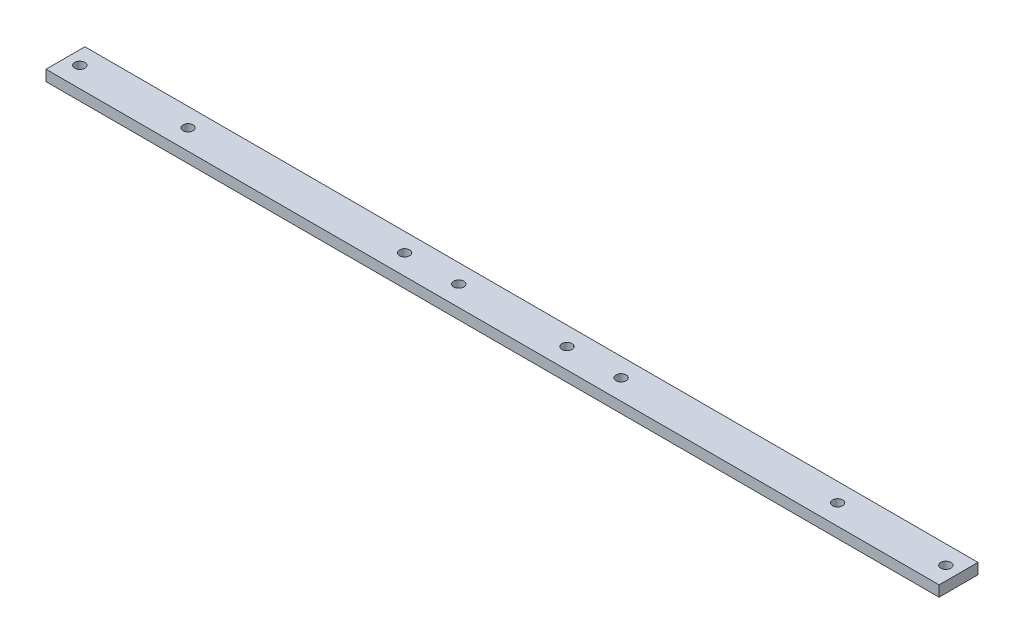
ISO-10303-21;
HEADER;
FILE_DESCRIPTION(('STEP AP214'),'2;1');
FILE_NAME('part.step','',(''),(''),'','','');
FILE_SCHEMA(('AUTOMOTIVE_DESIGN { 1 0 10303 214 1 1 1 1 }'));
ENDSEC;
DATA;
#1=APPLICATION_CONTEXT('core data for automotive mechanical design processes');
#2=APPLICATION_PROTOCOL_DEFINITION('international standard','automotive_design',2000,#1);
#3=PRODUCT_CONTEXT('',#1,'mechanical');
#4=PRODUCT('Part','Part','',(#3));
#5=PRODUCT_RELATED_PRODUCT_CATEGORY('part','',(#4));
#6=PRODUCT_DEFINITION_FORMATION('','',#4);
#7=PRODUCT_DEFINITION_CONTEXT('part definition',#1,'design');
#8=PRODUCT_DEFINITION('design','',#6,#7);
#9=PRODUCT_DEFINITION_SHAPE('','',#8);
#10=(LENGTH_UNIT() NAMED_UNIT(*) SI_UNIT(.MILLI.,.METRE.));
#11=(NAMED_UNIT(*) PLANE_ANGLE_UNIT() SI_UNIT($,.RADIAN.));
#12=(NAMED_UNIT(*) SI_UNIT($,.STERADIAN.) SOLID_ANGLE_UNIT());
#13=UNCERTAINTY_MEASURE_WITH_UNIT(LENGTH_MEASURE(1.E-05),#10,'distance_accuracy_value','');
#14=(GEOMETRIC_REPRESENTATION_CONTEXT(3) GLOBAL_UNCERTAINTY_ASSIGNED_CONTEXT((#13)) GLOBAL_UNIT_ASSIGNED_CONTEXT((#10,
#11,#12)) REPRESENTATION_CONTEXT('',''));
#15=CARTESIAN_POINT('',(0.,0.,0.));
#16=DIRECTION('',(0.,0.,1.));
#17=DIRECTION('',(1.,0.,0.));
#18=AXIS2_PLACEMENT_3D('',#15,#16,#17);
#19=CARTESIAN_POINT('',(4.,3.175,-4.53563414267659));
#20=DIRECTION('',(0.,-1.,0.));
#21=DIRECTION('',(0.,0.,-1.));
#22=AXIS2_PLACEMENT_3D('',#19,#20,#21);
#23=CYLINDRICAL_SURFACE('',#22,1.50000000000002);
#24=CARTESIAN_POINT('',(4.,3.175,-4.53563414267659));
#25=DIRECTION('',(0.,1.,0.));
#26=DIRECTION('',(0.,0.,1.));
#27=AXIS2_PLACEMENT_3D('',#24,#25,#26);
#28=CIRCLE('',#27,1.50000000000002);
#29=CARTESIAN_POINT('',(4.,3.175,-3.03563414267657));
#30=VERTEX_POINT('',#29);
#31=EDGE_CURVE('E131',#30,#30,#28,.F.);
#32=ORIENTED_EDGE('',*,*,#31,.F.);
#33=EDGE_LOOP('',(#32));
#34=FACE_BOUND('',#33,.T.);
#35=CARTESIAN_POINT('',(4.,0.,-4.53563414267659));
#36=DIRECTION('',(0.,1.,0.));
#37=DIRECTION('',(0.,0.,1.));
#38=AXIS2_PLACEMENT_3D('',#35,#36,#37);
#39=CIRCLE('',#38,1.50000000000002);
#40=CARTESIAN_POINT('',(4.,0.,-3.03563414267657));
#41=VERTEX_POINT('',#40);
#42=EDGE_CURVE('E152',#41,#41,#39,.F.);
#43=ORIENTED_EDGE('',*,*,#42,.T.);
#44=EDGE_LOOP('',(#43));
#45=FACE_BOUND('',#44,.T.);
#46=ADVANCED_FACE('F80',(#34,#45),#23,.F.);
#47=CARTESIAN_POINT('',(228.,3.175,-4.53563414267659));
#48=DIRECTION('',(0.,-1.,0.));
#49=DIRECTION('',(0.,0.,-1.));
#50=AXIS2_PLACEMENT_3D('',#47,#48,#49);
#51=CYLINDRICAL_SURFACE('',#50,1.5);
#52=CARTESIAN_POINT('',(228.,3.175,-4.53563414267659));
#53=DIRECTION('',(0.,1.,0.));
#54=DIRECTION('',(0.,0.,1.));
#55=AXIS2_PLACEMENT_3D('',#52,#53,#54);
#56=CIRCLE('',#55,1.5);
#57=CARTESIAN_POINT('',(228.,3.175,-3.03563414267659));
#58=VERTEX_POINT('',#57);
#59=EDGE_CURVE('E168',#58,#58,#56,.T.);
#60=ORIENTED_EDGE('',*,*,#59,.T.);
#61=EDGE_LOOP('',(#60));
#62=FACE_BOUND('',#61,.T.);
#63=CARTESIAN_POINT('',(228.,0.,-4.53563414267659));
#64=DIRECTION('',(0.,1.,0.));
#65=DIRECTION('',(0.,0.,1.));
#66=AXIS2_PLACEMENT_3D('',#63,#64,#65);
#67=CIRCLE('',#66,1.5);
#68=CARTESIAN_POINT('',(228.,0.,-3.03563414267659));
#69=VERTEX_POINT('',#68);
#70=EDGE_CURVE('E149',#69,#69,#67,.T.);
#71=ORIENTED_EDGE('',*,*,#70,.F.);
#72=EDGE_LOOP('',(#71));
#73=FACE_BOUND('',#72,.T.);
#74=ADVANCED_FACE('F178',(#62,#73),#51,.F.);
#75=CARTESIAN_POINT('',(260.,3.175,-4.53563414267659));
#76=DIRECTION('',(0.,-1.,0.));
#77=DIRECTION('',(0.,0.,-1.));
#78=AXIS2_PLACEMENT_3D('',#75,#76,#77);
#79=CYLINDRICAL_SURFACE('',#78,1.50000000000002);
#80=CARTESIAN_POINT('',(260.,3.175,-4.53563414267659));
#81=DIRECTION('',(0.,1.,0.));
#82=DIRECTION('',(0.,0.,1.));
#83=AXIS2_PLACEMENT_3D('',#80,#81,#82);
#84=CIRCLE('',#83,1.50000000000002);
#85=CARTESIAN_POINT('',(260.,3.175,-3.03563414267657));
#86=VERTEX_POINT('',#85);
#87=EDGE_CURVE('E166',#86,#86,#84,.T.);
#88=ORIENTED_EDGE('',*,*,#87,.T.);
#89=EDGE_LOOP('',(#88));
#90=FACE_BOUND('',#89,.T.);
#91=CARTESIAN_POINT('',(260.,0.,-4.53563414267659));
#92=DIRECTION('',(0.,1.,0.));
#93=DIRECTION('',(0.,0.,1.));
#94=AXIS2_PLACEMENT_3D('',#91,#92,#93);
#95=CIRCLE('',#94,1.50000000000002);
#96=CARTESIAN_POINT('',(260.,0.,-3.03563414267657));
#97=VERTEX_POINT('',#96);
#98=EDGE_CURVE('E146',#97,#97,#95,.T.);
#99=ORIENTED_EDGE('',*,*,#98,.F.);
#100=EDGE_LOOP('',(#99));
#101=FACE_BOUND('',#100,.T.);
#102=ADVANCED_FACE('F183',(#90,#101),#79,.F.);
#103=CARTESIAN_POINT('',(36.,3.175,-4.53563414267659));
#104=DIRECTION('',(0.,-1.,0.));
#105=DIRECTION('',(0.,0.,-1.));
#106=AXIS2_PLACEMENT_3D('',#103,#104,#105);
#107=CYLINDRICAL_SURFACE('',#106,1.5);
#108=CARTESIAN_POINT('',(36.,3.175,-4.53563414267659));
#109=DIRECTION('',(0.,1.,0.));
#110=DIRECTION('',(0.,0.,1.));
#111=AXIS2_PLACEMENT_3D('',#108,#109,#110);
#112=CIRCLE('',#111,1.5);
#113=CARTESIAN_POINT('',(36.,3.175,-3.03563414267659));
#114=VERTEX_POINT('',#113);
#115=EDGE_CURVE('E163',#114,#114,#112,.T.);
#116=ORIENTED_EDGE('',*,*,#115,.T.);
#117=EDGE_LOOP('',(#116));
#118=FACE_BOUND('',#117,.T.);
#119=CARTESIAN_POINT('',(36.,0.,-4.53563414267659));
#120=DIRECTION('',(0.,1.,0.));
#121=DIRECTION('',(0.,0.,1.));
#122=AXIS2_PLACEMENT_3D('',#119,#120,#121);
#123=CIRCLE('',#122,1.5);
#124=CARTESIAN_POINT('',(36.,0.,-3.03563414267659));
#125=VERTEX_POINT('',#124);
#126=EDGE_CURVE('E123',#125,#125,#123,.T.);
#127=ORIENTED_EDGE('',*,*,#126,.F.);
#128=EDGE_LOOP('',(#127));
#129=FACE_BOUND('',#128,.T.);
#130=ADVANCED_FACE('F190',(#118,#129),#107,.F.);
#131=CARTESIAN_POINT('',(264.,3.175,0.));
#132=DIRECTION('',(-1.,0.,0.));
#133=DIRECTION('',(0.,0.,1.));
#134=AXIS2_PLACEMENT_3D('',#131,#132,#133);
#135=PLANE('',#134);
#136=DIRECTION('',(0.,0.,-1.));
#137=VECTOR('',#136,1.);
#138=CARTESIAN_POINT('',(264.,0.,0.));
#139=LINE('',#138,#137);
#140=CARTESIAN_POINT('',(264.,0.,1.46436585732346));
#141=VERTEX_POINT('',#140);
#142=CARTESIAN_POINT('',(264.,0.,-10.0356341426765));
#143=VERTEX_POINT('',#142);
#144=EDGE_CURVE('E124',#141,#143,#139,.T.);
#145=ORIENTED_EDGE('',*,*,#144,.T.);
#146=DIRECTION('',(0.,1.,0.));
#147=VECTOR('',#146,1.);
#148=CARTESIAN_POINT('',(264.,-6.825,-10.0356341426765));
#149=LINE('',#148,#147);
#150=CARTESIAN_POINT('',(264.,3.175,-10.0356341426765));
#151=VERTEX_POINT('',#150);
#152=EDGE_CURVE('E206',#143,#151,#149,.T.);
#153=ORIENTED_EDGE('',*,*,#152,.T.);
#154=DIRECTION('',(0.,0.,-1.));
#155=VECTOR('',#154,1.);
#156=CARTESIAN_POINT('',(264.,3.175,0.));
#157=LINE('',#156,#155);
#158=CARTESIAN_POINT('',(264.,3.175,1.46436585732346));
#159=VERTEX_POINT('',#158);
#160=EDGE_CURVE('E156',#159,#151,#157,.T.);
#161=ORIENTED_EDGE('',*,*,#160,.F.);
#162=DIRECTION('',(0.,-1.,0.));
#163=VECTOR('',#162,1.);
#164=CARTESIAN_POINT('',(264.,3.175,1.46436585732346));
#165=LINE('',#164,#163);
#166=EDGE_CURVE('E12',#159,#141,#165,.T.);
#167=ORIENTED_EDGE('',*,*,#166,.T.);
#168=EDGE_LOOP('',(#145,#153,#161,#167));
#169=FACE_BOUND('',#168,.T.);
#170=ADVANCED_FACE('F194',(#169),#135,.F.);
#171=CARTESIAN_POINT('',(0.,3.175,0.));
#172=DIRECTION('',(1.,0.,0.));
#173=DIRECTION('',(0.,0.,-1.));
#174=AXIS2_PLACEMENT_3D('',#171,#172,#173);
#175=PLANE('',#174);
#176=DIRECTION('',(0.,0.,1.));
#177=VECTOR('',#176,1.);
#178=CARTESIAN_POINT('',(0.,3.175,0.));
#179=LINE('',#178,#177);
#180=CARTESIAN_POINT('',(0.,3.175,-10.0356341426765));
#181=VERTEX_POINT('',#180);
#182=CARTESIAN_POINT('',(0.,3.175,1.46436585732346));
#183=VERTEX_POINT('',#182);
#184=EDGE_CURVE('E103',#181,#183,#179,.T.);
#185=ORIENTED_EDGE('',*,*,#184,.F.);
#186=DIRECTION('',(0.,1.,0.));
#187=VECTOR('',#186,1.);
#188=CARTESIAN_POINT('',(0.,-6.825,-10.0356341426765));
#189=LINE('',#188,#187);
#190=CARTESIAN_POINT('',(0.,0.,-10.0356341426765));
#191=VERTEX_POINT('',#190);
#192=EDGE_CURVE('E95',#191,#181,#189,.T.);
#193=ORIENTED_EDGE('',*,*,#192,.F.);
#194=DIRECTION('',(0.,0.,1.));
#195=VECTOR('',#194,1.);
#196=CARTESIAN_POINT('',(0.,0.,0.));
#197=LINE('',#196,#195);
#198=CARTESIAN_POINT('',(0.,0.,1.46436585732346));
#199=VERTEX_POINT('',#198);
#200=EDGE_CURVE('E116',#191,#199,#197,.T.);
#201=ORIENTED_EDGE('',*,*,#200,.T.);
#202=DIRECTION('',(0.,-1.,0.));
#203=VECTOR('',#202,1.);
#204=CARTESIAN_POINT('',(0.,3.175,1.46436585732346));
#205=LINE('',#204,#203);
#206=EDGE_CURVE('E88',#183,#199,#205,.T.);
#207=ORIENTED_EDGE('',*,*,#206,.F.);
#208=EDGE_LOOP('',(#185,#193,#201,#207));
#209=FACE_BOUND('',#208,.T.);
#210=ADVANCED_FACE('F118',(#209),#175,.F.);
#211=CARTESIAN_POINT('',(0.,3.175,1.46436585732346));
#212=DIRECTION('',(0.,0.,-1.));
#213=DIRECTION('',(-1.,0.,0.));
#214=AXIS2_PLACEMENT_3D('',#211,#212,#213);
#215=PLANE('',#214);
#216=DIRECTION('',(1.,0.,0.));
#217=VECTOR('',#216,1.);
#218=CARTESIAN_POINT('',(0.,0.,1.46436585732346));
#219=LINE('',#218,#217);
#220=EDGE_CURVE('E129',#199,#141,#219,.T.);
#221=ORIENTED_EDGE('',*,*,#220,.T.);
#222=ORIENTED_EDGE('',*,*,#166,.F.);
#223=DIRECTION('',(1.,0.,0.));
#224=VECTOR('',#223,1.);
#225=CARTESIAN_POINT('',(0.,3.175,1.46436585732346));
#226=LINE('',#225,#224);
#227=EDGE_CURVE('E130',#183,#159,#226,.T.);
#228=ORIENTED_EDGE('',*,*,#227,.F.);
#229=ORIENTED_EDGE('',*,*,#206,.T.);
#230=EDGE_LOOP('',(#221,#222,#228,#229));
#231=FACE_BOUND('',#230,.T.);
#232=ADVANCED_FACE('F82',(#231),#215,.F.);
#233=CARTESIAN_POINT('',(0.,0.,0.));
#234=DIRECTION('',(0.,1.,0.));
#235=DIRECTION('',(0.,0.,1.));
#236=AXIS2_PLACEMENT_3D('',#233,#234,#235);
#237=PLANE('',#236);
#238=CARTESIAN_POINT('',(100.,0.,-4.53563414267659));
#239=DIRECTION('',(0.,1.,0.));
#240=DIRECTION('',(0.,0.,1.));
#241=AXIS2_PLACEMENT_3D('',#238,#239,#240);
#242=CIRCLE('',#241,1.5);
#243=CARTESIAN_POINT('',(100.,0.,-3.03563414267659));
#244=VERTEX_POINT('',#243);
#245=EDGE_CURVE('E135',#244,#244,#242,.T.);
#246=ORIENTED_EDGE('',*,*,#245,.T.);
#247=EDGE_LOOP('',(#246));
#248=FACE_BOUND('',#247,.T.);
#249=CARTESIAN_POINT('',(116.,0.,-4.53563414267659));
#250=DIRECTION('',(0.,1.,0.));
#251=DIRECTION('',(0.,0.,1.));
#252=AXIS2_PLACEMENT_3D('',#249,#250,#251);
#253=CIRCLE('',#252,1.5);
#254=CARTESIAN_POINT('',(116.,0.,-3.03563414267659));
#255=VERTEX_POINT('',#254);
#256=EDGE_CURVE('E139',#255,#255,#253,.T.);
#257=ORIENTED_EDGE('',*,*,#256,.T.);
#258=EDGE_LOOP('',(#257));
#259=FACE_BOUND('',#258,.T.);
#260=CARTESIAN_POINT('',(148.,0.,-4.53563414267659));
#261=DIRECTION('',(0.,1.,0.));
#262=DIRECTION('',(0.,0.,1.));
#263=AXIS2_PLACEMENT_3D('',#260,#261,#262);
#264=CIRCLE('',#263,1.5);
#265=CARTESIAN_POINT('',(148.,0.,-3.03563414267659));
#266=VERTEX_POINT('',#265);
#267=EDGE_CURVE('E232',#266,#266,#264,.T.);
#268=ORIENTED_EDGE('',*,*,#267,.T.);
#269=EDGE_LOOP('',(#268));
#270=FACE_BOUND('',#269,.T.);
#271=CARTESIAN_POINT('',(164.,0.,-4.53563414267659));
#272=DIRECTION('',(0.,1.,0.));
#273=DIRECTION('',(0.,0.,1.));
#274=AXIS2_PLACEMENT_3D('',#271,#272,#273);
#275=CIRCLE('',#274,1.5);
#276=CARTESIAN_POINT('',(164.,0.,-3.03563414267659));
#277=VERTEX_POINT('',#276);
#278=EDGE_CURVE('E221',#277,#277,#275,.T.);
#279=ORIENTED_EDGE('',*,*,#278,.T.);
#280=EDGE_LOOP('',(#279));
#281=FACE_BOUND('',#280,.T.);
#282=ORIENTED_EDGE('',*,*,#200,.F.);
#283=DIRECTION('',(1.,0.,0.));
#284=VECTOR('',#283,1.);
#285=CARTESIAN_POINT('',(0.,0.,-10.0356341426765));
#286=LINE('',#285,#284);
#287=EDGE_CURVE('E214',#191,#143,#286,.T.);
#288=ORIENTED_EDGE('',*,*,#287,.T.);
#289=ORIENTED_EDGE('',*,*,#144,.F.);
#290=ORIENTED_EDGE('',*,*,#220,.F.);
#291=EDGE_LOOP('',(#282,#288,#289,#290));
#292=FACE_BOUND('',#291,.T.);
#293=ORIENTED_EDGE('',*,*,#126,.T.);
#294=EDGE_LOOP('',(#293));
#295=FACE_BOUND('',#294,.T.);
#296=ORIENTED_EDGE('',*,*,#98,.T.);
#297=EDGE_LOOP('',(#296));
#298=FACE_BOUND('',#297,.T.);
#299=ORIENTED_EDGE('',*,*,#70,.T.);
#300=EDGE_LOOP('',(#299));
#301=FACE_BOUND('',#300,.T.);
#302=ORIENTED_EDGE('',*,*,#42,.F.);
#303=EDGE_LOOP('',(#302));
#304=FACE_BOUND('',#303,.T.);
#305=ADVANCED_FACE('F132',(#248,#259,#270,#281,#292,#295,#298,#301,#304),#237,.F.);
#306=CARTESIAN_POINT('',(0.,3.175,0.));
#307=DIRECTION('',(0.,1.,0.));
#308=DIRECTION('',(0.,0.,1.));
#309=AXIS2_PLACEMENT_3D('',#306,#307,#308);
#310=PLANE('',#309);
#311=DIRECTION('',(1.,0.,0.));
#312=VECTOR('',#311,1.);
#313=CARTESIAN_POINT('',(0.,3.175,-10.0356341426765));
#314=LINE('',#313,#312);
#315=EDGE_CURVE('E209',#181,#151,#314,.T.);
#316=ORIENTED_EDGE('',*,*,#315,.F.);
#317=ORIENTED_EDGE('',*,*,#184,.T.);
#318=ORIENTED_EDGE('',*,*,#227,.T.);
#319=ORIENTED_EDGE('',*,*,#160,.T.);
#320=EDGE_LOOP('',(#316,#317,#318,#319));
#321=FACE_BOUND('',#320,.T.);
#322=CARTESIAN_POINT('',(100.,3.175,-4.53563414267659));
#323=DIRECTION('',(0.,1.,0.));
#324=DIRECTION('',(0.,0.,1.));
#325=AXIS2_PLACEMENT_3D('',#322,#323,#324);
#326=CIRCLE('',#325,1.5);
#327=CARTESIAN_POINT('',(100.,3.175,-3.03563414267659));
#328=VERTEX_POINT('',#327);
#329=EDGE_CURVE('E218',#328,#328,#326,.T.);
#330=ORIENTED_EDGE('',*,*,#329,.F.);
#331=EDGE_LOOP('',(#330));
#332=FACE_BOUND('',#331,.T.);
#333=CARTESIAN_POINT('',(116.,3.175,-4.53563414267659));
#334=DIRECTION('',(0.,1.,0.));
#335=DIRECTION('',(0.,0.,1.));
#336=AXIS2_PLACEMENT_3D('',#333,#334,#335);
#337=CIRCLE('',#336,1.5);
#338=CARTESIAN_POINT('',(116.,3.175,-3.03563414267659));
#339=VERTEX_POINT('',#338);
#340=EDGE_CURVE('E222',#339,#339,#337,.T.);
#341=ORIENTED_EDGE('',*,*,#340,.F.);
#342=EDGE_LOOP('',(#341));
#343=FACE_BOUND('',#342,.T.);
#344=CARTESIAN_POINT('',(148.,3.175,-4.53563414267659));
#345=DIRECTION('',(0.,1.,0.));
#346=DIRECTION('',(0.,0.,1.));
#347=AXIS2_PLACEMENT_3D('',#344,#345,#346);
#348=CIRCLE('',#347,1.5);
#349=CARTESIAN_POINT('',(148.,3.175,-3.03563414267659));
#350=VERTEX_POINT('',#349);
#351=EDGE_CURVE('E225',#350,#350,#348,.T.);
#352=ORIENTED_EDGE('',*,*,#351,.F.);
#353=EDGE_LOOP('',(#352));
#354=FACE_BOUND('',#353,.T.);
#355=CARTESIAN_POINT('',(164.,3.175,-4.53563414267659));
#356=DIRECTION('',(0.,1.,0.));
#357=DIRECTION('',(0.,0.,1.));
#358=AXIS2_PLACEMENT_3D('',#355,#356,#357);
#359=CIRCLE('',#358,1.5);
#360=CARTESIAN_POINT('',(164.,3.175,-3.03563414267659));
#361=VERTEX_POINT('',#360);
#362=EDGE_CURVE('E217',#361,#361,#359,.T.);
#363=ORIENTED_EDGE('',*,*,#362,.F.);
#364=EDGE_LOOP('',(#363));
#365=FACE_BOUND('',#364,.T.);
#366=ORIENTED_EDGE('',*,*,#115,.F.);
#367=EDGE_LOOP('',(#366));
#368=FACE_BOUND('',#367,.T.);
#369=ORIENTED_EDGE('',*,*,#87,.F.);
#370=EDGE_LOOP('',(#369));
#371=FACE_BOUND('',#370,.T.);
#372=ORIENTED_EDGE('',*,*,#59,.F.);
#373=EDGE_LOOP('',(#372));
#374=FACE_BOUND('',#373,.T.);
#375=ORIENTED_EDGE('',*,*,#31,.T.);
#376=EDGE_LOOP('',(#375));
#377=FACE_BOUND('',#376,.T.);
#378=ADVANCED_FACE('F175',(#321,#332,#343,#354,#365,#368,#371,#374,#377),#310,.T.);
#379=CARTESIAN_POINT('',(164.,-6.825,-4.53563414267659));
#380=DIRECTION('',(0.,1.,0.));
#381=DIRECTION('',(0.,0.,1.));
#382=AXIS2_PLACEMENT_3D('',#379,#380,#381);
#383=CYLINDRICAL_SURFACE('',#382,1.5);
#384=ORIENTED_EDGE('',*,*,#362,.T.);
#385=EDGE_LOOP('',(#384));
#386=FACE_BOUND('',#385,.T.);
#387=ORIENTED_EDGE('',*,*,#278,.F.);
#388=EDGE_LOOP('',(#387));
#389=FACE_BOUND('',#388,.T.);
#390=ADVANCED_FACE('F251',(#386,#389),#383,.F.);
#391=CARTESIAN_POINT('',(148.,-6.825,-4.53563414267659));
#392=DIRECTION('',(0.,1.,0.));
#393=DIRECTION('',(0.,0.,1.));
#394=AXIS2_PLACEMENT_3D('',#391,#392,#393);
#395=CYLINDRICAL_SURFACE('',#394,1.5);
#396=ORIENTED_EDGE('',*,*,#351,.T.);
#397=EDGE_LOOP('',(#396));
#398=FACE_BOUND('',#397,.T.);
#399=ORIENTED_EDGE('',*,*,#267,.F.);
#400=EDGE_LOOP('',(#399));
#401=FACE_BOUND('',#400,.T.);
#402=ADVANCED_FACE('F242',(#398,#401),#395,.F.);
#403=CARTESIAN_POINT('',(116.,-6.825,-4.53563414267659));
#404=DIRECTION('',(0.,1.,0.));
#405=DIRECTION('',(0.,0.,1.));
#406=AXIS2_PLACEMENT_3D('',#403,#404,#405);
#407=CYLINDRICAL_SURFACE('',#406,1.5);
#408=ORIENTED_EDGE('',*,*,#340,.T.);
#409=EDGE_LOOP('',(#408));
#410=FACE_BOUND('',#409,.T.);
#411=ORIENTED_EDGE('',*,*,#256,.F.);
#412=EDGE_LOOP('',(#411));
#413=FACE_BOUND('',#412,.T.);
#414=ADVANCED_FACE('F239',(#410,#413),#407,.F.);
#415=CARTESIAN_POINT('',(100.,-6.825,-4.53563414267659));
#416=DIRECTION('',(0.,1.,0.));
#417=DIRECTION('',(0.,0.,1.));
#418=AXIS2_PLACEMENT_3D('',#415,#416,#417);
#419=CYLINDRICAL_SURFACE('',#418,1.5);
#420=ORIENTED_EDGE('',*,*,#329,.T.);
#421=EDGE_LOOP('',(#420));
#422=FACE_BOUND('',#421,.T.);
#423=ORIENTED_EDGE('',*,*,#245,.F.);
#424=EDGE_LOOP('',(#423));
#425=FACE_BOUND('',#424,.T.);
#426=ADVANCED_FACE('F241',(#422,#425),#419,.F.);
#427=CARTESIAN_POINT('',(0.,-6.825,-10.0356341426765));
#428=DIRECTION('',(0.,0.,1.));
#429=DIRECTION('',(1.,0.,0.));
#430=AXIS2_PLACEMENT_3D('',#427,#428,#429);
#431=PLANE('',#430);
#432=ORIENTED_EDGE('',*,*,#192,.T.);
#433=ORIENTED_EDGE('',*,*,#315,.T.);
#434=ORIENTED_EDGE('',*,*,#152,.F.);
#435=ORIENTED_EDGE('',*,*,#287,.F.);
#436=EDGE_LOOP('',(#432,#433,#434,#435));
#437=FACE_BOUND('',#436,.T.);
#438=ADVANCED_FACE('F210',(#437),#431,.F.);
#439=CLOSED_SHELL('',(#46,#74,#102,#130,#170,#210,#232,#305,#378,#390,#402,#414,#426,#438));
#440=MANIFOLD_SOLID_BREP('B2',#439);
#441=ADVANCED_BREP_SHAPE_REPRESENTATION('',(#18,#440),#14);
#442=SHAPE_DEFINITION_REPRESENTATION(#9,#441);
ENDSEC;
END-ISO-10303-21;
